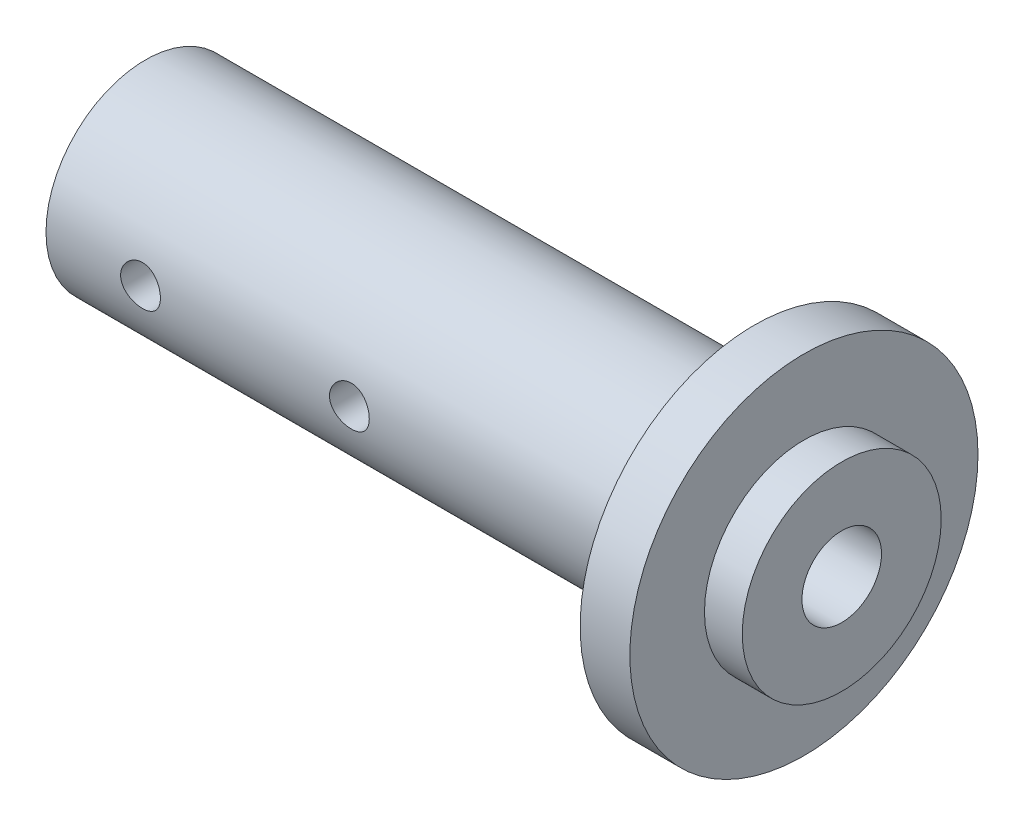
ISO-10303-21;
HEADER;
FILE_DESCRIPTION(('STEP AP214'),'2;1');
FILE_NAME('part.step','',(''),(''),'','','');
FILE_SCHEMA(('AUTOMOTIVE_DESIGN { 1 0 10303 214 1 1 1 1 }'));
ENDSEC;
DATA;
#1=APPLICATION_CONTEXT('core data for automotive mechanical design processes');
#2=APPLICATION_PROTOCOL_DEFINITION('international standard','automotive_design',2000,#1);
#3=PRODUCT_CONTEXT('',#1,'mechanical');
#4=PRODUCT('Part','Part','',(#3));
#5=PRODUCT_RELATED_PRODUCT_CATEGORY('part','',(#4));
#6=PRODUCT_DEFINITION_FORMATION('','',#4);
#7=PRODUCT_DEFINITION_CONTEXT('part definition',#1,'design');
#8=PRODUCT_DEFINITION('design','',#6,#7);
#9=PRODUCT_DEFINITION_SHAPE('','',#8);
#10=(LENGTH_UNIT() NAMED_UNIT(*) SI_UNIT(.MILLI.,.METRE.));
#11=(NAMED_UNIT(*) PLANE_ANGLE_UNIT() SI_UNIT($,.RADIAN.));
#12=(NAMED_UNIT(*) SI_UNIT($,.STERADIAN.) SOLID_ANGLE_UNIT());
#13=UNCERTAINTY_MEASURE_WITH_UNIT(LENGTH_MEASURE(1.E-05),#10,'distance_accuracy_value','');
#14=(GEOMETRIC_REPRESENTATION_CONTEXT(3) GLOBAL_UNCERTAINTY_ASSIGNED_CONTEXT((#13)) GLOBAL_UNIT_ASSIGNED_CONTEXT((#10,
#11,#12)) REPRESENTATION_CONTEXT('',''));
#15=CARTESIAN_POINT('',(0.,0.,0.));
#16=DIRECTION('',(0.,0.,1.));
#17=DIRECTION('',(1.,0.,0.));
#18=AXIS2_PLACEMENT_3D('',#15,#16,#17);
#19=CARTESIAN_POINT('',(-19.,0.,0.));
#20=DIRECTION('',(-1.,0.,0.));
#21=DIRECTION('',(0.,0.,1.));
#22=AXIS2_PLACEMENT_3D('',#19,#20,#21);
#23=PLANE('',#22);
#24=CARTESIAN_POINT('',(-19.,0.,0.));
#25=DIRECTION('',(1.,0.,0.));
#26=DIRECTION('',(0.,0.,-1.));
#27=AXIS2_PLACEMENT_3D('',#24,#25,#26);
#28=CIRCLE('',#27,4.);
#29=CARTESIAN_POINT('',(-19.,0.,-4.));
#30=VERTEX_POINT('',#29);
#31=EDGE_CURVE('E12',#30,#30,#28,.T.);
#32=ORIENTED_EDGE('',*,*,#31,.T.);
#33=EDGE_LOOP('',(#32));
#34=FACE_BOUND('',#33,.T.);
#35=ADVANCED_FACE('F52',(#34),#23,.F.);
#36=CARTESIAN_POINT('',(0.,0.,0.));
#37=DIRECTION('',(1.,0.,0.));
#38=DIRECTION('',(0.,0.,-1.));
#39=AXIS2_PLACEMENT_3D('',#36,#37,#38);
#40=CYLINDRICAL_SURFACE('',#39,4.);
#41=ORIENTED_EDGE('',*,*,#31,.F.);
#42=EDGE_LOOP('',(#41));
#43=FACE_BOUND('',#42,.T.);
#44=CARTESIAN_POINT('',(0.,0.,0.));
#45=DIRECTION('',(1.,0.,0.));
#46=DIRECTION('',(0.,0.,-1.));
#47=AXIS2_PLACEMENT_3D('',#44,#45,#46);
#48=CIRCLE('',#47,4.);
#49=CARTESIAN_POINT('',(0.,0.,-4.));
#50=VERTEX_POINT('',#49);
#51=EDGE_CURVE('E64',#50,#50,#48,.T.);
#52=ORIENTED_EDGE('',*,*,#51,.T.);
#53=EDGE_LOOP('',(#52));
#54=FACE_BOUND('',#53,.T.);
#55=ADVANCED_FACE('F105',(#43,#54),#40,.F.);
#56=CARTESIAN_POINT('',(0.,0.,0.));
#57=DIRECTION('',(-1.,0.,0.));
#58=DIRECTION('',(0.,0.,1.));
#59=AXIS2_PLACEMENT_3D('',#56,#57,#58);
#60=PLANE('',#59);
#61=ORIENTED_EDGE('',*,*,#51,.F.);
#62=EDGE_LOOP('',(#61));
#63=FACE_BOUND('',#62,.T.);
#64=CARTESIAN_POINT('',(0.,0.,0.));
#65=DIRECTION('',(1.,0.,0.));
#66=DIRECTION('',(0.,0.,-1.));
#67=AXIS2_PLACEMENT_3D('',#64,#65,#66);
#68=CIRCLE('',#67,10.);
#69=CARTESIAN_POINT('',(0.,0.,-10.));
#70=VERTEX_POINT('',#69);
#71=EDGE_CURVE('E69',#70,#70,#68,.T.);
#72=ORIENTED_EDGE('',*,*,#71,.T.);
#73=EDGE_LOOP('',(#72));
#74=FACE_BOUND('',#73,.T.);
#75=ADVANCED_FACE('F109',(#63,#74),#60,.F.);
#76=CARTESIAN_POINT('',(0.,0.,0.));
#77=DIRECTION('',(1.,0.,0.));
#78=DIRECTION('',(0.,0.,-1.));
#79=AXIS2_PLACEMENT_3D('',#76,#77,#78);
#80=CYLINDRICAL_SURFACE('',#79,10.);
#81=ORIENTED_EDGE('',*,*,#71,.F.);
#82=EDGE_LOOP('',(#81));
#83=FACE_BOUND('',#82,.T.);
#84=CARTESIAN_POINT('',(-3.8,0.,0.));
#85=DIRECTION('',(1.,0.,0.));
#86=DIRECTION('',(0.,0.,-1.));
#87=AXIS2_PLACEMENT_3D('',#84,#85,#86);
#88=CIRCLE('',#87,10.);
#89=CARTESIAN_POINT('',(-3.8,0.,-10.));
#90=VERTEX_POINT('',#89);
#91=EDGE_CURVE('E143',#90,#90,#88,.T.);
#92=ORIENTED_EDGE('',*,*,#91,.T.);
#93=EDGE_LOOP('',(#92));
#94=FACE_BOUND('',#93,.T.);
#95=ADVANCED_FACE('F114',(#83,#94),#80,.T.);
#96=CARTESIAN_POINT('',(-3.8,0.,0.));
#97=DIRECTION('',(-1.,0.,0.));
#98=DIRECTION('',(0.,0.,1.));
#99=AXIS2_PLACEMENT_3D('',#96,#97,#98);
#100=PLANE('',#99);
#101=ORIENTED_EDGE('',*,*,#91,.F.);
#102=EDGE_LOOP('',(#101));
#103=FACE_BOUND('',#102,.T.);
#104=CARTESIAN_POINT('',(-3.8,0.,0.));
#105=DIRECTION('',(1.,0.,0.));
#106=DIRECTION('',(0.,0.,-1.));
#107=AXIS2_PLACEMENT_3D('',#104,#105,#106);
#108=CIRCLE('',#107,17.5);
#109=CARTESIAN_POINT('',(-3.8,0.,-17.5));
#110=VERTEX_POINT('',#109);
#111=EDGE_CURVE('E140',#110,#110,#108,.T.);
#112=ORIENTED_EDGE('',*,*,#111,.T.);
#113=EDGE_LOOP('',(#112));
#114=FACE_BOUND('',#113,.T.);
#115=ADVANCED_FACE('F121',(#103,#114),#100,.F.);
#116=CARTESIAN_POINT('',(0.,0.,0.));
#117=DIRECTION('',(1.,0.,0.));
#118=DIRECTION('',(0.,0.,-1.));
#119=AXIS2_PLACEMENT_3D('',#116,#117,#118);
#120=CYLINDRICAL_SURFACE('',#119,17.5);
#121=CARTESIAN_POINT('',(-8.8,0.,0.));
#122=DIRECTION('',(1.,0.,0.));
#123=DIRECTION('',(0.,0.,-1.));
#124=AXIS2_PLACEMENT_3D('',#121,#122,#123);
#125=CIRCLE('',#124,17.5);
#126=CARTESIAN_POINT('',(-8.8,0.,-17.5));
#127=VERTEX_POINT('',#126);
#128=EDGE_CURVE('E139',#127,#127,#125,.T.);
#129=ORIENTED_EDGE('',*,*,#128,.T.);
#130=EDGE_LOOP('',(#129));
#131=FACE_BOUND('',#130,.T.);
#132=ORIENTED_EDGE('',*,*,#111,.F.);
#133=EDGE_LOOP('',(#132));
#134=FACE_BOUND('',#133,.T.);
#135=ADVANCED_FACE('F125',(#131,#134),#120,.T.);
#136=CARTESIAN_POINT('',(-8.8,0.,0.));
#137=DIRECTION('',(-1.,0.,0.));
#138=DIRECTION('',(0.,0.,1.));
#139=AXIS2_PLACEMENT_3D('',#136,#137,#138);
#140=PLANE('',#139);
#141=CARTESIAN_POINT('',(-8.8,0.,0.));
#142=DIRECTION('',(1.,0.,0.));
#143=DIRECTION('',(0.,0.,-1.));
#144=AXIS2_PLACEMENT_3D('',#141,#142,#143);
#145=CIRCLE('',#144,10.);
#146=CARTESIAN_POINT('',(-8.8,0.,-10.));
#147=VERTEX_POINT('',#146);
#148=EDGE_CURVE('E136',#147,#147,#145,.T.);
#149=ORIENTED_EDGE('',*,*,#148,.T.);
#150=EDGE_LOOP('',(#149));
#151=FACE_BOUND('',#150,.T.);
#152=ORIENTED_EDGE('',*,*,#128,.F.);
#153=EDGE_LOOP('',(#152));
#154=FACE_BOUND('',#153,.T.);
#155=ADVANCED_FACE('F101',(#151,#154),#140,.T.);
#156=CARTESIAN_POINT('',(0.,0.,0.));
#157=DIRECTION('',(1.,0.,0.));
#158=DIRECTION('',(0.,0.,-1.));
#159=AXIS2_PLACEMENT_3D('',#156,#157,#158);
#160=CYLINDRICAL_SURFACE('',#159,10.);
#161=CARTESIAN_POINT('',(-41.5000000000003,0.,-10.));
#162=CARTESIAN_POINT('',(-41.4999959110036,0.111153813585266,-9.99999795161742));
#163=CARTESIAN_POINT('',(-41.490702314065,0.222359320403045,-9.99812770356461));
#164=CARTESIAN_POINT('',(-41.4538029997698,0.441627015378038,-9.99084731246462));
#165=CARTESIAN_POINT('',(-41.4261827343972,0.549686635082711,-9.98543435720372));
#166=CARTESIAN_POINT('',(-41.3535174527587,0.759460610526627,-9.97167298556573));
#167=CARTESIAN_POINT('',(-41.3084891263109,0.861180935866271,-9.96332738153436));
#168=CARTESIAN_POINT('',(-41.2023355049777,1.05561597772845,-9.94460796070628));
#169=CARTESIAN_POINT('',(-41.1412111687859,1.14833123015163,-9.93423426471414));
#170=CARTESIAN_POINT('',(-41.0037230114174,1.32338695462973,-9.91244330659939));
#171=CARTESIAN_POINT('',(-40.9271832892179,1.40558790231705,-9.90101491008694));
#172=CARTESIAN_POINT('',(-40.7614151672169,1.55607351321606,-9.87848360905176));
#173=CARTESIAN_POINT('',(-40.67218577733,1.62435708954085,-9.86738073000847));
#174=CARTESIAN_POINT('',(-40.4825676139765,1.74566350669525,-9.8466488362523));
#175=CARTESIAN_POINT('',(-40.3820847124075,1.79854187773174,-9.83703414729891));
#176=CARTESIAN_POINT('',(-40.1734363619921,1.88661133316062,-9.82052536116835));
#177=CARTESIAN_POINT('',(-40.0652716733076,1.92180416487448,-9.81363099523923));
#178=CARTESIAN_POINT('',(-39.8458312721844,1.97305059976966,-9.80345610504409));
#179=CARTESIAN_POINT('',(-39.7346149117158,1.98934899591756,-9.80012940214375));
#180=CARTESIAN_POINT('',(-39.5109803572716,2.00310425545224,-9.79732750121254));
#181=CARTESIAN_POINT('',(-39.39856228736,2.00056304542701,-9.79785190935681));
#182=CARTESIAN_POINT('',(-39.1775064239583,1.97690914620364,-9.80265102296369));
#183=CARTESIAN_POINT('',(-39.0688371887456,1.95607708048782,-9.80686905717527));
#184=CARTESIAN_POINT('',(-38.8565678466743,1.89687576924611,-9.81849092320002));
#185=CARTESIAN_POINT('',(-38.7529679821623,1.85850568620137,-9.82589490715557));
#186=CARTESIAN_POINT('',(-38.5529694765931,1.76504956734945,-9.84311237000816));
#187=CARTESIAN_POINT('',(-38.4566242408619,1.70985230246424,-9.85294179627408));
#188=CARTESIAN_POINT('',(-38.2744583000546,1.58438714914537,-9.87389237546123));
#189=CARTESIAN_POINT('',(-38.188638806298,1.51411752871367,-9.88501367676731));
#190=CARTESIAN_POINT('',(-38.0283411950864,1.35899986912118,-9.90754042482923));
#191=CARTESIAN_POINT('',(-37.954094864282,1.2739123224249,-9.91894738421809));
#192=CARTESIAN_POINT('',(-37.8208923073978,1.09237004812403,-9.94057697428816));
#193=CARTESIAN_POINT('',(-37.7619362774131,0.995915174758788,-9.95079958977947));
#194=CARTESIAN_POINT('',(-37.6609449815483,0.794118773757852,-9.96893380321774));
#195=CARTESIAN_POINT('',(-37.6189362127112,0.68876363917061,-9.97684177696543));
#196=CARTESIAN_POINT('',(-37.5532790519231,0.472297952897339,-9.98942817975716));
#197=CARTESIAN_POINT('',(-37.529628435853,0.361188100144908,-9.99410700001062));
#198=CARTESIAN_POINT('',(-37.5016870924117,0.138358811254309,-9.99965343733735));
#199=CARTESIAN_POINT('',(-37.4970791609197,0.0266806566511598,-10.0005834930494));
#200=CARTESIAN_POINT('',(-37.5064997178846,-0.195849868385421,-9.99870103860205));
#201=CARTESIAN_POINT('',(-37.5205271587055,-0.306702284887579,-9.99588873882892));
#202=CARTESIAN_POINT('',(-37.5665567470882,-0.523411319893075,-9.98687664016035));
#203=CARTESIAN_POINT('',(-37.5983961369961,-0.629303896679799,-9.98070752808413));
#204=CARTESIAN_POINT('',(-37.6789679653119,-0.834247254999328,-9.96567104122065));
#205=CARTESIAN_POINT('',(-37.7277016693539,-0.933297523275074,-9.95680346428453));
#206=CARTESIAN_POINT('',(-37.8413649813029,-1.12308234737243,-9.93719823066589));
#207=CARTESIAN_POINT('',(-37.9064855620782,-1.21370025350437,-9.92643900874103));
#208=CARTESIAN_POINT('',(-38.0508183824148,-1.38283603823841,-9.90429469659764));
#209=CARTESIAN_POINT('',(-38.1300321328,-1.46135261786152,-9.89290953936775));
#210=CARTESIAN_POINT('',(-38.3017467037825,-1.60528118154835,-9.87058607113929));
#211=CARTESIAN_POINT('',(-38.3944314884429,-1.67047540489731,-9.85965720466608));
#212=CARTESIAN_POINT('',(-38.5896227227136,-1.78437084010241,-9.83968383592388));
#213=CARTESIAN_POINT('',(-38.6921287791474,-1.8330727118458,-9.83063925826685));
#214=CARTESIAN_POINT('',(-38.9035364922994,-1.91230368316392,-9.81553481168765));
#215=CARTESIAN_POINT('',(-39.0124016824209,-1.9429269995821,-9.80945949744373));
#216=CARTESIAN_POINT('',(-39.2338669069821,-1.98541730325439,-9.8009487358405));
#217=CARTESIAN_POINT('',(-39.346466452419,-1.99728673645022,-9.79851281382223));
#218=CARTESIAN_POINT('',(-39.5700177290889,-2.00184182173494,-9.79758299262758));
#219=CARTESIAN_POINT('',(-39.6809622978543,-1.99487157614179,-9.79901838378601));
#220=CARTESIAN_POINT('',(-39.9000632998103,-1.96270460820012,-9.80551146969227));
#221=CARTESIAN_POINT('',(-40.0082197553899,-1.9375080322586,-9.81056913534338));
#222=CARTESIAN_POINT('',(-40.2184554224814,-1.86975713699791,-9.82370528438317));
#223=CARTESIAN_POINT('',(-40.3205487210051,-1.82724501343469,-9.83177642037661));
#224=CARTESIAN_POINT('',(-40.5162074414691,-1.72610928920321,-9.8500342994834));
#225=CARTESIAN_POINT('',(-40.6097721474505,-1.66748433754976,-9.86022121997788));
#226=CARTESIAN_POINT('',(-40.7874311443009,-1.53461182957283,-9.8817792104645));
#227=CARTESIAN_POINT('',(-40.8713375305355,-1.46011577447036,-9.89316745819399));
#228=CARTESIAN_POINT('',(-41.0255724110586,-1.29812873802628,-9.91572163743909));
#229=CARTESIAN_POINT('',(-41.0958977806348,-1.21063477430667,-9.92688751726368));
#230=CARTESIAN_POINT('',(-41.2216692878932,-1.0240352581765,-9.94787664775942));
#231=CARTESIAN_POINT('',(-41.2769520065603,-0.924817768859671,-9.95768462438492));
#232=CARTESIAN_POINT('',(-41.3699722451934,-0.718332721881465,-9.97470250169999));
#233=CARTESIAN_POINT('',(-41.4077255790653,-0.611072521726253,-9.98191474277231));
#234=CARTESIAN_POINT('',(-41.4573038960897,-0.41964297784756,-9.99152745190741));
#235=CARTESIAN_POINT('',(-41.4732863874158,-0.33656332802757,-9.99468606316903));
#236=CARTESIAN_POINT('',(-41.494635824717,-0.168999050420134,-9.99892308279785));
#237=CARTESIAN_POINT('',(-41.5000031090198,-0.0845144674972382,-10.0000015574631));
#238=CARTESIAN_POINT('',(-41.5000000000003,0.,-10.));
#239=B_SPLINE_CURVE_WITH_KNOTS('',3,(#161,#162,#163,#164,#165,#166,#167,#168,#169,#170,#171,
#172,#173,#174,#175,#176,#177,#178,#179,#180,#181,#182,#183,#184,#185,#186,#187,#188,#189,#190,
#191,#192,#193,#194,#195,#196,#197,#198,#199,#200,#201,#202,#203,#204,#205,#206,#207,#208,#209,
#210,#211,#212,#213,#214,#215,#216,#217,#218,#219,#220,#221,#222,#223,#224,#225,#226,#227,#228,
#229,#230,#231,#232,#233,#234,#235,#236,#237,#238),.UNSPECIFIED.,.T.,.F.,(4,2,2,2,2,2,2,2,2,2,2,
2,2,2,2,2,2,2,2,2,2,2,2,2,2,2,2,2,2,2,2,2,2,2,2,2,2,2,4),(0.,0.333152261322516,
0.666569301382647,0.999667470500684,1.33274580446173,1.66986534022438,2.00701119349473,
2.34722390011846,2.68740298730395,3.02312370207175,3.35881008562451,3.68943454012557,
4.0200747850746,4.35294980407186,4.68586309499341,5.02476504982702,5.36367135079641,
5.70310549708049,6.04249851396073,6.37621471352531,6.70991215315736,7.04060907901448,
7.37133078432046,7.70610132066719,8.04090776691861,8.38081257158453,8.72070377446935,
9.05880762065448,9.39686736660831,9.72879445135405,10.0607188698522,10.3918392250622,
10.7229873516373,11.0597615247829,11.3966130906586,11.7369899335128,12.0770591103504,
12.3303755057979,12.5836838274199),.UNSPECIFIED.);
#240=CARTESIAN_POINT('',(-41.5000000000003,0.,-10.));
#241=VERTEX_POINT('',#240);
#242=EDGE_CURVE('E55',#241,#241,#239,.T.);
#243=ORIENTED_EDGE('',*,*,#242,.F.);
#244=EDGE_LOOP('',(#243));
#245=FACE_BOUND('',#244,.T.);
#246=CARTESIAN_POINT('',(-37.5000000000003,0.,10.));
#247=CARTESIAN_POINT('',(-37.500004088997,0.111153813585269,9.99999795161742));
#248=CARTESIAN_POINT('',(-37.5092976859356,0.222359320403048,9.99812770356461));
#249=CARTESIAN_POINT('',(-37.5461970002307,0.441627015378042,9.99084731246462));
#250=CARTESIAN_POINT('',(-37.5738172656033,0.549686635082715,9.98543435720372));
#251=CARTESIAN_POINT('',(-37.6464825472418,0.759460610526629,9.97167298556573));
#252=CARTESIAN_POINT('',(-37.6915108736896,0.861180935866272,9.96332738153436));
#253=CARTESIAN_POINT('',(-37.7976644950229,1.05561597772846,9.94460796070628));
#254=CARTESIAN_POINT('',(-37.8587888312147,1.14833123015163,9.93423426471414));
#255=CARTESIAN_POINT('',(-37.9962769885831,1.32338695462974,9.91244330659939));
#256=CARTESIAN_POINT('',(-38.0728167107827,1.40558790231705,9.90101491008694));
#257=CARTESIAN_POINT('',(-38.2385848327837,1.55607351321606,9.87848360905176));
#258=CARTESIAN_POINT('',(-38.3278142226705,1.62435708954086,9.86738073000847));
#259=CARTESIAN_POINT('',(-38.517432386024,1.74566350669525,9.8466488362523));
#260=CARTESIAN_POINT('',(-38.617915287593,1.79854187773174,9.83703414729892));
#261=CARTESIAN_POINT('',(-38.8265636380084,1.88661133316062,9.82052536116835));
#262=CARTESIAN_POINT('',(-38.934728326693,1.92180416487448,9.81363099523923));
#263=CARTESIAN_POINT('',(-39.1541687278161,1.97305059976966,9.80345610504408));
#264=CARTESIAN_POINT('',(-39.2653850882847,1.98934899591756,9.80012940214375));
#265=CARTESIAN_POINT('',(-39.4890196427289,2.00310425545224,9.79732750121254));
#266=CARTESIAN_POINT('',(-39.6014377126406,2.00056304542701,9.79785190935681));
#267=CARTESIAN_POINT('',(-39.8224935760423,1.97690914620364,9.80265102296369));
#268=CARTESIAN_POINT('',(-39.9311628112549,1.95607708048782,9.80686905717527));
#269=CARTESIAN_POINT('',(-40.1434321533263,1.89687576924611,9.81849092320002));
#270=CARTESIAN_POINT('',(-40.2470320178383,1.85850568620137,9.82589490715557));
#271=CARTESIAN_POINT('',(-40.4470305234075,1.76504956734944,9.84311237000816));
#272=CARTESIAN_POINT('',(-40.5433757591386,1.70985230246423,9.85294179627408));
#273=CARTESIAN_POINT('',(-40.7255416999459,1.58438714914536,9.87389237546123));
#274=CARTESIAN_POINT('',(-40.8113611937026,1.51411752871366,9.88501367676731));
#275=CARTESIAN_POINT('',(-40.9716588049141,1.35899986912118,9.90754042482923));
#276=CARTESIAN_POINT('',(-41.0459051357185,1.2739123224249,9.91894738421809));
#277=CARTESIAN_POINT('',(-41.1791076926027,1.09237004812402,9.94057697428816));
#278=CARTESIAN_POINT('',(-41.2380637225874,0.995915174758781,9.95079958977947));
#279=CARTESIAN_POINT('',(-41.3390550184522,0.794118773757843,9.96893380321774));
#280=CARTESIAN_POINT('',(-41.3810637872893,0.688763639170602,9.97684177696543));
#281=CARTESIAN_POINT('',(-41.4467209480774,0.472297952897333,9.98942817975716));
#282=CARTESIAN_POINT('',(-41.4703715641475,0.361188100144902,9.99410700001062));
#283=CARTESIAN_POINT('',(-41.4983129075888,0.138358811254304,9.99965343733735));
#284=CARTESIAN_POINT('',(-41.5029208390808,0.0266806566511548,10.0005834930494));
#285=CARTESIAN_POINT('',(-41.4935002821159,-0.195849868385426,9.99870103860205));
#286=CARTESIAN_POINT('',(-41.4794728412951,-0.306702284887584,9.99588873882892));
#287=CARTESIAN_POINT('',(-41.4334432529124,-0.523411319893079,9.98687664016035));
#288=CARTESIAN_POINT('',(-41.4016038630045,-0.629303896679802,9.98070752808413));
#289=CARTESIAN_POINT('',(-41.3210320346887,-0.834247254999331,9.96567104122065));
#290=CARTESIAN_POINT('',(-41.2722983306466,-0.933297523275077,9.95680346428453));
#291=CARTESIAN_POINT('',(-41.1586350186976,-1.12308234737243,9.93719823066589));
#292=CARTESIAN_POINT('',(-41.0935144379224,-1.21370025350437,9.92643900874103));
#293=CARTESIAN_POINT('',(-40.9491816175857,-1.38283603823841,9.90429469659765));
#294=CARTESIAN_POINT('',(-40.8699678672005,-1.46135261786152,9.89290953936776));
#295=CARTESIAN_POINT('',(-40.698253296218,-1.60528118154835,9.8705860711393));
#296=CARTESIAN_POINT('',(-40.6055685115576,-1.67047540489731,9.85965720466608));
#297=CARTESIAN_POINT('',(-40.4103772772869,-1.78437084010241,9.83968383592388));
#298=CARTESIAN_POINT('',(-40.3078712208532,-1.83307271184581,9.83063925826685));
#299=CARTESIAN_POINT('',(-40.0964635077012,-1.91230368316392,9.81553481168765));
#300=CARTESIAN_POINT('',(-39.9875983175796,-1.9429269995821,9.80945949744373));
#301=CARTESIAN_POINT('',(-39.7661330930184,-1.98541730325439,9.8009487358405));
#302=CARTESIAN_POINT('',(-39.6535335475816,-1.99728673645022,9.79851281382223));
#303=CARTESIAN_POINT('',(-39.4299822709116,-2.00184182173494,9.79758299262758));
#304=CARTESIAN_POINT('',(-39.3190377021462,-1.99487157614179,9.79901838378601));
#305=CARTESIAN_POINT('',(-39.0999367001902,-1.96270460820012,9.80551146969227));
#306=CARTESIAN_POINT('',(-38.9917802446106,-1.9375080322586,9.81056913534338));
#307=CARTESIAN_POINT('',(-38.7815445775192,-1.86975713699791,9.82370528438317));
#308=CARTESIAN_POINT('',(-38.6794512789954,-1.82724501343469,9.83177642037661));
#309=CARTESIAN_POINT('',(-38.4837925585314,-1.72610928920321,9.8500342994834));
#310=CARTESIAN_POINT('',(-38.39022785255,-1.66748433754976,9.86022121997788));
#311=CARTESIAN_POINT('',(-38.2125688556996,-1.53461182957282,9.8817792104645));
#312=CARTESIAN_POINT('',(-38.1286624694651,-1.46011577447035,9.89316745819399));
#313=CARTESIAN_POINT('',(-37.9744275889419,-1.29812873802627,9.91572163743909));
#314=CARTESIAN_POINT('',(-37.9041022193657,-1.21063477430667,9.92688751726369));
#315=CARTESIAN_POINT('',(-37.7783307121074,-1.02403525817649,9.94787664775943));
#316=CARTESIAN_POINT('',(-37.7230479934402,-0.924817768859665,9.95768462438492));
#317=CARTESIAN_POINT('',(-37.6300277548071,-0.718332721881461,9.97470250169999));
#318=CARTESIAN_POINT('',(-37.5922744209353,-0.61107252172625,9.98191474277231));
#319=CARTESIAN_POINT('',(-37.5426961039108,-0.419642977847557,9.99152745190741));
#320=CARTESIAN_POINT('',(-37.5267136125848,-0.336563328027568,9.99468606316903));
#321=CARTESIAN_POINT('',(-37.5053641752835,-0.168999050420132,9.99892308279785));
#322=CARTESIAN_POINT('',(-37.4999968909807,-0.0845144674972355,10.0000015574631));
#323=CARTESIAN_POINT('',(-37.5000000000003,0.,10.));
#324=B_SPLINE_CURVE_WITH_KNOTS('',3,(#246,#247,#248,#249,#250,#251,#252,#253,#254,#255,#256,
#257,#258,#259,#260,#261,#262,#263,#264,#265,#266,#267,#268,#269,#270,#271,#272,#273,#274,#275,
#276,#277,#278,#279,#280,#281,#282,#283,#284,#285,#286,#287,#288,#289,#290,#291,#292,#293,#294,
#295,#296,#297,#298,#299,#300,#301,#302,#303,#304,#305,#306,#307,#308,#309,#310,#311,#312,#313,
#314,#315,#316,#317,#318,#319,#320,#321,#322,#323),.UNSPECIFIED.,.T.,.F.,(4,2,2,2,2,2,2,2,2,2,2,
2,2,2,2,2,2,2,2,2,2,2,2,2,2,2,2,2,2,2,2,2,2,2,2,2,2,2,4),(0.,0.333152261322516,
0.666569301382647,0.999667470500685,1.33274580446173,1.66986534022437,2.00701119349474,
2.34722390011846,2.68740298730396,3.02312370207175,3.3588100856245,3.68943454012557,
4.0200747850746,4.35294980407186,4.68586309499341,5.02476504982702,5.36367135079641,
5.70310549708049,6.04249851396073,6.37621471352531,6.70991215315736,7.04060907901447,
7.37133078432046,7.70610132066718,8.04090776691861,8.38081257158454,8.72070377446935,
9.05880762065448,9.39686736660832,9.72879445135405,10.0607188698522,10.3918392250622,
10.7229873516374,11.0597615247829,11.3966130906586,11.7369899335128,12.0770591103504,
12.3303755057979,12.5836838274199),.UNSPECIFIED.);
#325=CARTESIAN_POINT('',(-37.5000000000003,0.,10.));
#326=VERTEX_POINT('',#325);
#327=EDGE_CURVE('E161',#326,#326,#324,.T.);
#328=ORIENTED_EDGE('',*,*,#327,.F.);
#329=EDGE_LOOP('',(#328));
#330=FACE_BOUND('',#329,.T.);
#331=CARTESIAN_POINT('',(-62.5000000000003,0.,-10.));
#332=CARTESIAN_POINT('',(-62.4999959110036,0.111153813585266,-9.99999795161742));
#333=CARTESIAN_POINT('',(-62.490702314065,0.222359320403045,-9.99812770356461));
#334=CARTESIAN_POINT('',(-62.4538029997698,0.441627015378039,-9.99084731246462));
#335=CARTESIAN_POINT('',(-62.4261827343973,0.549686635082712,-9.98543435720372));
#336=CARTESIAN_POINT('',(-62.3535174527587,0.759460610526626,-9.97167298556573));
#337=CARTESIAN_POINT('',(-62.3084891263109,0.861180935866269,-9.96332738153436));
#338=CARTESIAN_POINT('',(-62.2023355049777,1.05561597772845,-9.94460796070628));
#339=CARTESIAN_POINT('',(-62.1412111687859,1.14833123015162,-9.93423426471414));
#340=CARTESIAN_POINT('',(-62.0037230114174,1.32338695462973,-9.91244330659939));
#341=CARTESIAN_POINT('',(-61.9271832892179,1.40558790231705,-9.90101491008694));
#342=CARTESIAN_POINT('',(-61.7614151672169,1.55607351321605,-9.87848360905176));
#343=CARTESIAN_POINT('',(-61.67218577733,1.62435708954085,-9.86738073000847));
#344=CARTESIAN_POINT('',(-61.4825676139765,1.74566350669524,-9.8466488362523));
#345=CARTESIAN_POINT('',(-61.3820847124075,1.79854187773174,-9.83703414729892));
#346=CARTESIAN_POINT('',(-61.1734363619921,1.88661133316062,-9.82052536116835));
#347=CARTESIAN_POINT('',(-61.0652716733076,1.92180416487448,-9.81363099523923));
#348=CARTESIAN_POINT('',(-60.8458312721844,1.97305059976966,-9.80345610504409));
#349=CARTESIAN_POINT('',(-60.7346149117158,1.98934899591756,-9.80012940214375));
#350=CARTESIAN_POINT('',(-60.5109803572716,2.00310425545224,-9.79732750121254));
#351=CARTESIAN_POINT('',(-60.39856228736,2.00056304542701,-9.79785190935681));
#352=CARTESIAN_POINT('',(-60.1775064239583,1.97690914620365,-9.80265102296369));
#353=CARTESIAN_POINT('',(-60.0688371887456,1.95607708048782,-9.80686905717527));
#354=CARTESIAN_POINT('',(-59.8565678466743,1.89687576924611,-9.81849092320002));
#355=CARTESIAN_POINT('',(-59.7529679821623,1.85850568620137,-9.82589490715557));
#356=CARTESIAN_POINT('',(-59.5529694765931,1.76504956734945,-9.84311237000816));
#357=CARTESIAN_POINT('',(-59.4566242408619,1.70985230246424,-9.85294179627408));
#358=CARTESIAN_POINT('',(-59.2744583000546,1.58438714914537,-9.87389237546123));
#359=CARTESIAN_POINT('',(-59.188638806298,1.51411752871367,-9.88501367676731));
#360=CARTESIAN_POINT('',(-59.0283411950864,1.35899986912118,-9.90754042482923));
#361=CARTESIAN_POINT('',(-58.954094864282,1.2739123224249,-9.91894738421809));
#362=CARTESIAN_POINT('',(-58.8208923073978,1.09237004812403,-9.94057697428816));
#363=CARTESIAN_POINT('',(-58.7619362774131,0.995915174758791,-9.95079958977947));
#364=CARTESIAN_POINT('',(-58.6609449815483,0.794118773757854,-9.96893380321774));
#365=CARTESIAN_POINT('',(-58.6189362127112,0.688763639170613,-9.97684177696543));
#366=CARTESIAN_POINT('',(-58.5532790519231,0.472297952897342,-9.98942817975716));
#367=CARTESIAN_POINT('',(-58.529628435853,0.361188100144911,-9.99410700001062));
#368=CARTESIAN_POINT('',(-58.5016870924117,0.138358811254312,-9.99965343733735));
#369=CARTESIAN_POINT('',(-58.4970791609197,0.0266806566511635,-10.0005834930494));
#370=CARTESIAN_POINT('',(-58.5064997178846,-0.195849868385417,-9.99870103860205));
#371=CARTESIAN_POINT('',(-58.5205271587055,-0.306702284887575,-9.99588873882892));
#372=CARTESIAN_POINT('',(-58.5665567470882,-0.523411319893071,-9.98687664016035));
#373=CARTESIAN_POINT('',(-58.5983961369961,-0.629303896679796,-9.98070752808413));
#374=CARTESIAN_POINT('',(-58.6789679653119,-0.834247254999325,-9.96567104122065));
#375=CARTESIAN_POINT('',(-58.7277016693539,-0.93329752327507,-9.95680346428453));
#376=CARTESIAN_POINT('',(-58.8413649813029,-1.12308234737243,-9.93719823066589));
#377=CARTESIAN_POINT('',(-58.9064855620781,-1.21370025350437,-9.92643900874103));
#378=CARTESIAN_POINT('',(-59.0508183824148,-1.38283603823841,-9.90429469659765));
#379=CARTESIAN_POINT('',(-59.1300321328,-1.46135261786152,-9.89290953936776));
#380=CARTESIAN_POINT('',(-59.3017467037825,-1.60528118154835,-9.8705860711393));
#381=CARTESIAN_POINT('',(-59.3944314884429,-1.67047540489731,-9.85965720466608));
#382=CARTESIAN_POINT('',(-59.5896227227136,-1.78437084010241,-9.83968383592388));
#383=CARTESIAN_POINT('',(-59.6921287791474,-1.8330727118458,-9.83063925826685));
#384=CARTESIAN_POINT('',(-59.9035364922994,-1.91230368316392,-9.81553481168765));
#385=CARTESIAN_POINT('',(-60.0124016824209,-1.9429269995821,-9.80945949744373));
#386=CARTESIAN_POINT('',(-60.2338669069821,-1.98541730325439,-9.8009487358405));
#387=CARTESIAN_POINT('',(-60.346466452419,-1.99728673645022,-9.79851281382223));
#388=CARTESIAN_POINT('',(-60.5700177290889,-2.00184182173494,-9.79758299262758));
#389=CARTESIAN_POINT('',(-60.6809622978543,-1.99487157614179,-9.79901838378601));
#390=CARTESIAN_POINT('',(-60.9000632998103,-1.96270460820012,-9.80551146969227));
#391=CARTESIAN_POINT('',(-61.0082197553899,-1.9375080322586,-9.81056913534338));
#392=CARTESIAN_POINT('',(-61.2184554224814,-1.86975713699791,-9.82370528438317));
#393=CARTESIAN_POINT('',(-61.3205487210051,-1.82724501343469,-9.83177642037661));
#394=CARTESIAN_POINT('',(-61.5162074414691,-1.72610928920321,-9.8500342994834));
#395=CARTESIAN_POINT('',(-61.6097721474505,-1.66748433754977,-9.86022121997788));
#396=CARTESIAN_POINT('',(-61.7874311443009,-1.53461182957283,-9.8817792104645));
#397=CARTESIAN_POINT('',(-61.8713375305355,-1.46011577447036,-9.89316745819399));
#398=CARTESIAN_POINT('',(-62.0255724110586,-1.29812873802628,-9.91572163743909));
#399=CARTESIAN_POINT('',(-62.0958977806348,-1.21063477430667,-9.92688751726368));
#400=CARTESIAN_POINT('',(-62.2216692878932,-1.0240352581765,-9.94787664775942));
#401=CARTESIAN_POINT('',(-62.2769520065603,-0.924817768859675,-9.95768462438492));
#402=CARTESIAN_POINT('',(-62.3699722451935,-0.718332721881471,-9.97470250169999));
#403=CARTESIAN_POINT('',(-62.4077255790653,-0.611072521726258,-9.98191474277231));
#404=CARTESIAN_POINT('',(-62.4573038960897,-0.419642977847563,-9.99152745190741));
#405=CARTESIAN_POINT('',(-62.4732863874158,-0.336563328027573,-9.99468606316903));
#406=CARTESIAN_POINT('',(-62.494635824717,-0.168999050420136,-9.99892308279785));
#407=CARTESIAN_POINT('',(-62.5000031090198,-0.0845144674972392,-10.0000015574631));
#408=CARTESIAN_POINT('',(-62.5000000000003,0.,-10.));
#409=B_SPLINE_CURVE_WITH_KNOTS('',3,(#331,#332,#333,#334,#335,#336,#337,#338,#339,#340,#341,
#342,#343,#344,#345,#346,#347,#348,#349,#350,#351,#352,#353,#354,#355,#356,#357,#358,#359,#360,
#361,#362,#363,#364,#365,#366,#367,#368,#369,#370,#371,#372,#373,#374,#375,#376,#377,#378,#379,
#380,#381,#382,#383,#384,#385,#386,#387,#388,#389,#390,#391,#392,#393,#394,#395,#396,#397,#398,
#399,#400,#401,#402,#403,#404,#405,#406,#407,#408),.UNSPECIFIED.,.T.,.F.,(4,2,2,2,2,2,2,2,2,2,2,
2,2,2,2,2,2,2,2,2,2,2,2,2,2,2,2,2,2,2,2,2,2,2,2,2,2,2,4),(0.,0.333152261322517,
0.666569301382645,0.999667470500683,1.33274580446173,1.66986534022437,2.00701119349473,
2.34722390011846,2.68740298730395,3.02312370207174,3.3588100856245,3.68943454012557,
4.0200747850746,4.35294980407186,4.68586309499341,5.02476504982702,5.36367135079641,
5.70310549708048,6.04249851396072,6.37621471352531,6.70991215315736,7.04060907901447,
7.37133078432046,7.70610132066718,8.04090776691861,8.38081257158453,8.72070377446935,
9.05880762065447,9.3968673666083,9.72879445135404,10.0607188698522,10.3918392250622,
10.7229873516373,11.0597615247829,11.3966130906586,11.7369899335128,12.0770591103504,
12.3303755057979,12.5836838274199),.UNSPECIFIED.);
#410=CARTESIAN_POINT('',(-62.5000000000003,0.,-10.));
#411=VERTEX_POINT('',#410);
#412=EDGE_CURVE('E80',#411,#411,#409,.T.);
#413=ORIENTED_EDGE('',*,*,#412,.F.);
#414=EDGE_LOOP('',(#413));
#415=FACE_BOUND('',#414,.T.);
#416=CARTESIAN_POINT('',(-58.5000000000003,0.,10.));
#417=CARTESIAN_POINT('',(-58.500004088997,0.11115381358527,9.99999795161742));
#418=CARTESIAN_POINT('',(-58.5092976859355,0.222359320403049,9.99812770356461));
#419=CARTESIAN_POINT('',(-58.5461970002307,0.441627015378043,9.99084731246462));
#420=CARTESIAN_POINT('',(-58.5738172656033,0.549686635082716,9.98543435720372));
#421=CARTESIAN_POINT('',(-58.6464825472418,0.75946061052663,9.97167298556573));
#422=CARTESIAN_POINT('',(-58.6915108736896,0.861180935866272,9.96332738153436));
#423=CARTESIAN_POINT('',(-58.7976644950229,1.05561597772846,9.94460796070628));
#424=CARTESIAN_POINT('',(-58.8587888312147,1.14833123015163,9.93423426471414));
#425=CARTESIAN_POINT('',(-58.9962769885831,1.32338695462974,9.91244330659939));
#426=CARTESIAN_POINT('',(-59.0728167107827,1.40558790231706,9.90101491008694));
#427=CARTESIAN_POINT('',(-59.2385848327837,1.55607351321607,9.87848360905176));
#428=CARTESIAN_POINT('',(-59.3278142226705,1.62435708954086,9.86738073000847));
#429=CARTESIAN_POINT('',(-59.517432386024,1.74566350669525,9.8466488362523));
#430=CARTESIAN_POINT('',(-59.617915287593,1.79854187773174,9.83703414729892));
#431=CARTESIAN_POINT('',(-59.8265636380084,1.88661133316062,9.82052536116835));
#432=CARTESIAN_POINT('',(-59.9347283266929,1.92180416487448,9.81363099523923));
#433=CARTESIAN_POINT('',(-60.1541687278161,1.97305059976966,9.80345610504409));
#434=CARTESIAN_POINT('',(-60.2653850882847,1.98934899591756,9.80012940214375));
#435=CARTESIAN_POINT('',(-60.4890196427289,2.00310425545224,9.79732750121254));
#436=CARTESIAN_POINT('',(-60.6014377126406,2.00056304542701,9.79785190935681));
#437=CARTESIAN_POINT('',(-60.8224935760423,1.97690914620364,9.80265102296369));
#438=CARTESIAN_POINT('',(-60.9311628112549,1.95607708048782,9.80686905717527));
#439=CARTESIAN_POINT('',(-61.1434321533263,1.89687576924611,9.81849092320002));
#440=CARTESIAN_POINT('',(-61.2470320178383,1.85850568620137,9.82589490715557));
#441=CARTESIAN_POINT('',(-61.4470305234075,1.76504956734945,9.84311237000816));
#442=CARTESIAN_POINT('',(-61.5433757591386,1.70985230246424,9.85294179627409));
#443=CARTESIAN_POINT('',(-61.7255416999459,1.58438714914537,9.87389237546123));
#444=CARTESIAN_POINT('',(-61.8113611937026,1.51411752871367,9.88501367676731));
#445=CARTESIAN_POINT('',(-61.9716588049141,1.35899986912118,9.90754042482923));
#446=CARTESIAN_POINT('',(-62.0459051357185,1.2739123224249,9.91894738421809));
#447=CARTESIAN_POINT('',(-62.1791076926027,1.09237004812403,9.94057697428816));
#448=CARTESIAN_POINT('',(-62.2380637225874,0.995915174758783,9.95079958977947));
#449=CARTESIAN_POINT('',(-62.3390550184522,0.794118773757844,9.96893380321774));
#450=CARTESIAN_POINT('',(-62.3810637872893,0.688763639170602,9.97684177696543));
#451=CARTESIAN_POINT('',(-62.4467209480774,0.472297952897332,9.98942817975716));
#452=CARTESIAN_POINT('',(-62.4703715641475,0.361188100144903,9.99410700001062));
#453=CARTESIAN_POINT('',(-62.4983129075888,0.138358811254305,9.99965343733735));
#454=CARTESIAN_POINT('',(-62.5029208390808,0.0266806566511557,10.0005834930494));
#455=CARTESIAN_POINT('',(-62.4935002821159,-0.195849868385425,9.99870103860205));
#456=CARTESIAN_POINT('',(-62.4794728412951,-0.306702284887584,9.99588873882892));
#457=CARTESIAN_POINT('',(-62.4334432529124,-0.523411319893079,9.98687664016035));
#458=CARTESIAN_POINT('',(-62.4016038630045,-0.629303896679804,9.98070752808413));
#459=CARTESIAN_POINT('',(-62.3210320346887,-0.834247254999332,9.96567104122065));
#460=CARTESIAN_POINT('',(-62.2722983306466,-0.933297523275077,9.95680346428453));
#461=CARTESIAN_POINT('',(-62.1586350186976,-1.12308234737243,9.93719823066589));
#462=CARTESIAN_POINT('',(-62.0935144379224,-1.21370025350437,9.92643900874103));
#463=CARTESIAN_POINT('',(-61.9491816175857,-1.38283603823841,9.90429469659764));
#464=CARTESIAN_POINT('',(-61.8699678672005,-1.46135261786152,9.89290953936775));
#465=CARTESIAN_POINT('',(-61.698253296218,-1.60528118154835,9.87058607113929));
#466=CARTESIAN_POINT('',(-61.6055685115576,-1.67047540489731,9.85965720466608));
#467=CARTESIAN_POINT('',(-61.4103772772869,-1.78437084010241,9.83968383592388));
#468=CARTESIAN_POINT('',(-61.3078712208532,-1.83307271184581,9.83063925826685));
#469=CARTESIAN_POINT('',(-61.0964635077012,-1.91230368316392,9.81553481168765));
#470=CARTESIAN_POINT('',(-60.9875983175796,-1.9429269995821,9.80945949744373));
#471=CARTESIAN_POINT('',(-60.7661330930184,-1.98541730325439,9.8009487358405));
#472=CARTESIAN_POINT('',(-60.6535335475816,-1.99728673645022,9.79851281382223));
#473=CARTESIAN_POINT('',(-60.4299822709116,-2.00184182173494,9.79758299262758));
#474=CARTESIAN_POINT('',(-60.3190377021462,-1.99487157614179,9.79901838378601));
#475=CARTESIAN_POINT('',(-60.0999367001902,-1.96270460820012,9.80551146969227));
#476=CARTESIAN_POINT('',(-59.9917802446106,-1.93750803225859,9.81056913534338));
#477=CARTESIAN_POINT('',(-59.7815445775192,-1.86975713699791,9.82370528438317));
#478=CARTESIAN_POINT('',(-59.6794512789954,-1.82724501343469,9.83177642037661));
#479=CARTESIAN_POINT('',(-59.4837925585314,-1.72610928920321,9.8500342994834));
#480=CARTESIAN_POINT('',(-59.39022785255,-1.66748433754977,9.86022121997788));
#481=CARTESIAN_POINT('',(-59.2125688556996,-1.53461182957283,9.8817792104645));
#482=CARTESIAN_POINT('',(-59.1286624694651,-1.46011577447036,9.89316745819398));
#483=CARTESIAN_POINT('',(-58.9744275889419,-1.29812873802628,9.91572163743909));
#484=CARTESIAN_POINT('',(-58.9041022193657,-1.21063477430667,9.92688751726369));
#485=CARTESIAN_POINT('',(-58.7783307121074,-1.02403525817649,9.94787664775943));
#486=CARTESIAN_POINT('',(-58.7230479934402,-0.924817768859665,9.95768462438492));
#487=CARTESIAN_POINT('',(-58.6300277548071,-0.718332721881461,9.97470250169999));
#488=CARTESIAN_POINT('',(-58.5922744209353,-0.61107252172625,9.98191474277231));
#489=CARTESIAN_POINT('',(-58.5426961039108,-0.419642977847556,9.99152745190741));
#490=CARTESIAN_POINT('',(-58.5267136125848,-0.336563328027566,9.99468606316903));
#491=CARTESIAN_POINT('',(-58.5053641752835,-0.16899905042013,9.99892308279785));
#492=CARTESIAN_POINT('',(-58.4999968909807,-0.0845144674972342,10.0000015574631));
#493=CARTESIAN_POINT('',(-58.5000000000003,0.,10.));
#494=B_SPLINE_CURVE_WITH_KNOTS('',3,(#416,#417,#418,#419,#420,#421,#422,#423,#424,#425,#426,
#427,#428,#429,#430,#431,#432,#433,#434,#435,#436,#437,#438,#439,#440,#441,#442,#443,#444,#445,
#446,#447,#448,#449,#450,#451,#452,#453,#454,#455,#456,#457,#458,#459,#460,#461,#462,#463,#464,
#465,#466,#467,#468,#469,#470,#471,#472,#473,#474,#475,#476,#477,#478,#479,#480,#481,#482,#483,
#484,#485,#486,#487,#488,#489,#490,#491,#492,#493),.UNSPECIFIED.,.T.,.F.,(4,2,2,2,2,2,2,2,2,2,2,
2,2,2,2,2,2,2,2,2,2,2,2,2,2,2,2,2,2,2,2,2,2,2,2,2,2,2,4),(0.,0.333152261322517,
0.666569301382647,0.999667470500685,1.33274580446173,1.66986534022438,2.00701119349474,
2.34722390011846,2.68740298730396,3.02312370207175,3.3588100856245,3.68943454012557,
4.0200747850746,4.35294980407185,4.68586309499341,5.02476504982701,5.36367135079641,
5.70310549708049,6.04249851396073,6.37621471352531,6.70991215315736,7.04060907901448,
7.37133078432046,7.70610132066718,8.04090776691861,8.38081257158453,8.72070377446935,
9.05880762065448,9.39686736660831,9.72879445135404,10.0607188698522,10.3918392250622,
10.7229873516373,11.0597615247829,11.3966130906586,11.7369899335128,12.0770591103504,
12.3303755057979,12.5836838274199),.UNSPECIFIED.);
#495=CARTESIAN_POINT('',(-58.5000000000003,0.,10.));
#496=VERTEX_POINT('',#495);
#497=EDGE_CURVE('E73',#496,#496,#494,.T.);
#498=ORIENTED_EDGE('',*,*,#497,.F.);
#499=EDGE_LOOP('',(#498));
#500=FACE_BOUND('',#499,.T.);
#501=CARTESIAN_POINT('',(-70.,0.,0.));
#502=DIRECTION('',(1.,0.,0.));
#503=DIRECTION('',(0.,0.,-1.));
#504=AXIS2_PLACEMENT_3D('',#501,#502,#503);
#505=CIRCLE('',#504,9.99999999999999);
#506=CARTESIAN_POINT('',(-70.,0.,-9.99999999999999));
#507=VERTEX_POINT('',#506);
#508=EDGE_CURVE('E145',#507,#507,#505,.T.);
#509=ORIENTED_EDGE('',*,*,#508,.T.);
#510=EDGE_LOOP('',(#509));
#511=FACE_BOUND('',#510,.T.);
#512=ORIENTED_EDGE('',*,*,#148,.F.);
#513=EDGE_LOOP('',(#512));
#514=FACE_BOUND('',#513,.T.);
#515=ADVANCED_FACE('F84',(#245,#330,#415,#500,#511,#514),#160,.T.);
#516=CARTESIAN_POINT('',(-70.,0.,0.));
#517=DIRECTION('',(-1.,0.,0.));
#518=DIRECTION('',(0.,0.,1.));
#519=AXIS2_PLACEMENT_3D('',#516,#517,#518);
#520=PLANE('',#519);
#521=ORIENTED_EDGE('',*,*,#508,.F.);
#522=EDGE_LOOP('',(#521));
#523=FACE_BOUND('',#522,.T.);
#524=ADVANCED_FACE('F92',(#523),#520,.T.);
#525=CARTESIAN_POINT('',(-60.5000000000003,0.,-17.5));
#526=DIRECTION('',(0.,0.,1.));
#527=DIRECTION('',(1.,0.,0.));
#528=AXIS2_PLACEMENT_3D('',#525,#526,#527);
#529=CYLINDRICAL_SURFACE('',#528,2.);
#530=ORIENTED_EDGE('',*,*,#412,.T.);
#531=EDGE_LOOP('',(#530));
#532=FACE_BOUND('',#531,.T.);
#533=ORIENTED_EDGE('',*,*,#497,.T.);
#534=EDGE_LOOP('',(#533));
#535=FACE_BOUND('',#534,.T.);
#536=ADVANCED_FACE('F88',(#532,#535),#529,.F.);
#537=CARTESIAN_POINT('',(-39.5000000000003,0.,-17.5));
#538=DIRECTION('',(0.,0.,1.));
#539=DIRECTION('',(1.,0.,0.));
#540=AXIS2_PLACEMENT_3D('',#537,#538,#539);
#541=CYLINDRICAL_SURFACE('',#540,2.);
#542=ORIENTED_EDGE('',*,*,#242,.T.);
#543=EDGE_LOOP('',(#542));
#544=FACE_BOUND('',#543,.T.);
#545=ORIENTED_EDGE('',*,*,#327,.T.);
#546=EDGE_LOOP('',(#545));
#547=FACE_BOUND('',#546,.T.);
#548=ADVANCED_FACE('F91',(#544,#547),#541,.F.);
#549=CLOSED_SHELL('',(#35,#55,#75,#95,#115,#135,#155,#515,#524,#536,#548));
#550=MANIFOLD_SOLID_BREP('B2',#549);
#551=ADVANCED_BREP_SHAPE_REPRESENTATION('',(#18,#550),#14);
#552=SHAPE_DEFINITION_REPRESENTATION(#9,#551);
ENDSEC;
END-ISO-10303-21;
